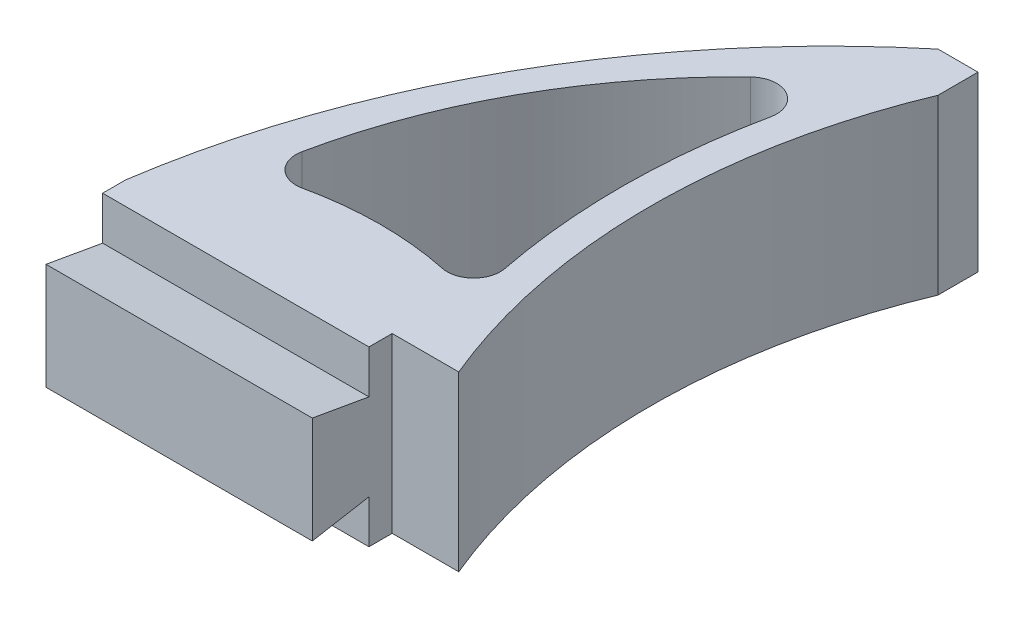
ISO-10303-21;
HEADER;
FILE_DESCRIPTION(('STEP AP214'),'2;1');
FILE_NAME('part.step','',(''),(''),'','','');
FILE_SCHEMA(('AUTOMOTIVE_DESIGN { 1 0 10303 214 1 1 1 1 }'));
ENDSEC;
DATA;
#1=APPLICATION_CONTEXT('core data for automotive mechanical design processes');
#2=APPLICATION_PROTOCOL_DEFINITION('international standard','automotive_design',2000,#1);
#3=PRODUCT_CONTEXT('',#1,'mechanical');
#4=PRODUCT('Part','Part','',(#3));
#5=PRODUCT_RELATED_PRODUCT_CATEGORY('part','',(#4));
#6=PRODUCT_DEFINITION_FORMATION('','',#4);
#7=PRODUCT_DEFINITION_CONTEXT('part definition',#1,'design');
#8=PRODUCT_DEFINITION('design','',#6,#7);
#9=PRODUCT_DEFINITION_SHAPE('','',#8);
#10=(LENGTH_UNIT() NAMED_UNIT(*) SI_UNIT(.MILLI.,.METRE.));
#11=(NAMED_UNIT(*) PLANE_ANGLE_UNIT() SI_UNIT($,.RADIAN.));
#12=(NAMED_UNIT(*) SI_UNIT($,.STERADIAN.) SOLID_ANGLE_UNIT());
#13=UNCERTAINTY_MEASURE_WITH_UNIT(LENGTH_MEASURE(1.E-05),#10,'distance_accuracy_value','');
#14=(GEOMETRIC_REPRESENTATION_CONTEXT(3) GLOBAL_UNCERTAINTY_ASSIGNED_CONTEXT((#13)) GLOBAL_UNIT_ASSIGNED_CONTEXT((#10,
#11,#12)) REPRESENTATION_CONTEXT('',''));
#15=CARTESIAN_POINT('',(0.,0.,0.));
#16=DIRECTION('',(0.,0.,1.));
#17=DIRECTION('',(1.,0.,0.));
#18=AXIS2_PLACEMENT_3D('',#15,#16,#17);
#19=CARTESIAN_POINT('',(20.,6.5,0.));
#20=DIRECTION('',(0.,0.,-1.));
#21=DIRECTION('',(-1.,0.,0.));
#22=AXIS2_PLACEMENT_3D('',#19,#20,#21);
#23=PLANE('',#22);
#24=DIRECTION('',(0.,-1.,0.));
#25=VECTOR('',#24,1.);
#26=CARTESIAN_POINT('',(20.,6.5,0.));
#27=LINE('',#26,#25);
#28=CARTESIAN_POINT('',(20.,4.,0.));
#29=VERTEX_POINT('',#28);
#30=CARTESIAN_POINT('',(20.,-4.,0.));
#31=VERTEX_POINT('',#30);
#32=EDGE_CURVE('E269',#29,#31,#27,.T.);
#33=ORIENTED_EDGE('',*,*,#32,.F.);
#34=DIRECTION('',(-1.,0.,0.));
#35=VECTOR('',#34,1.);
#36=CARTESIAN_POINT('',(25.,4.,0.));
#37=LINE('',#36,#35);
#38=CARTESIAN_POINT('',(0.,4.,0.));
#39=VERTEX_POINT('',#38);
#40=EDGE_CURVE('E249',#29,#39,#37,.T.);
#41=ORIENTED_EDGE('',*,*,#40,.T.);
#42=DIRECTION('',(0.,-1.,0.));
#43=VECTOR('',#42,1.);
#44=CARTESIAN_POINT('',(0.,6.5,0.));
#45=LINE('',#44,#43);
#46=CARTESIAN_POINT('',(0.,-4.,0.));
#47=VERTEX_POINT('',#46);
#48=EDGE_CURVE('E307',#39,#47,#45,.T.);
#49=ORIENTED_EDGE('',*,*,#48,.T.);
#50=DIRECTION('',(-1.,0.,0.));
#51=VECTOR('',#50,1.);
#52=CARTESIAN_POINT('',(25.,-4.,0.));
#53=LINE('',#52,#51);
#54=EDGE_CURVE('E261',#31,#47,#53,.T.);
#55=ORIENTED_EDGE('',*,*,#54,.F.);
#56=EDGE_LOOP('',(#33,#41,#49,#55));
#57=FACE_BOUND('',#56,.T.);
#58=ADVANCED_FACE('F44',(#57),#23,.F.);
#59=CARTESIAN_POINT('',(0.,6.5,0.));
#60=DIRECTION('',(1.,0.,0.));
#61=DIRECTION('',(0.,0.,-1.));
#62=AXIS2_PLACEMENT_3D('',#59,#60,#61);
#63=PLANE('',#62);
#64=DIRECTION('',(0.,-1.,0.));
#65=VECTOR('',#64,1.);
#66=CARTESIAN_POINT('',(0.,3.25,-4.25346136471318));
#67=LINE('',#66,#65);
#68=CARTESIAN_POINT('',(0.,6.5,-4.25346136471318));
#69=VERTEX_POINT('',#68);
#70=CARTESIAN_POINT('',(0.,3.25,-4.25346136471318));
#71=VERTEX_POINT('',#70);
#72=EDGE_CURVE('E243',#69,#71,#67,.T.);
#73=ORIENTED_EDGE('',*,*,#72,.F.);
#74=DIRECTION('',(0.,0.,1.));
#75=VECTOR('',#74,1.);
#76=CARTESIAN_POINT('',(0.,6.5,0.));
#77=LINE('',#76,#75);
#78=CARTESIAN_POINT('',(0.,6.5,-6.));
#79=VERTEX_POINT('',#78);
#80=EDGE_CURVE('E303',#79,#69,#77,.T.);
#81=ORIENTED_EDGE('',*,*,#80,.F.);
#82=DIRECTION('',(0.,-1.,0.));
#83=VECTOR('',#82,1.);
#84=CARTESIAN_POINT('',(0.,6.5,-6.));
#85=LINE('',#84,#83);
#86=CARTESIAN_POINT('',(0.,-6.5,-6.));
#87=VERTEX_POINT('',#86);
#88=EDGE_CURVE('E332',#79,#87,#85,.T.);
#89=ORIENTED_EDGE('',*,*,#88,.T.);
#90=DIRECTION('',(0.,0.,1.));
#91=VECTOR('',#90,1.);
#92=CARTESIAN_POINT('',(0.,-6.5,0.));
#93=LINE('',#92,#91);
#94=CARTESIAN_POINT('',(0.,-6.5,-4.25346136471318));
#95=VERTEX_POINT('',#94);
#96=EDGE_CURVE('E288',#87,#95,#93,.T.);
#97=ORIENTED_EDGE('',*,*,#96,.T.);
#98=DIRECTION('',(0.,-1.,0.));
#99=VECTOR('',#98,1.);
#100=CARTESIAN_POINT('',(0.,-3.25,-4.25346136471318));
#101=LINE('',#100,#99);
#102=CARTESIAN_POINT('',(0.,-3.25,-4.25346136471318));
#103=VERTEX_POINT('',#102);
#104=EDGE_CURVE('E262',#103,#95,#101,.T.);
#105=ORIENTED_EDGE('',*,*,#104,.F.);
#106=DIRECTION('',(0.,0.173648177666935,-0.984807753012207));
#107=VECTOR('',#106,1.);
#108=CARTESIAN_POINT('',(0.,-4.,0.));
#109=LINE('',#108,#107);
#110=EDGE_CURVE('E246',#47,#103,#109,.T.);
#111=ORIENTED_EDGE('',*,*,#110,.F.);
#112=ORIENTED_EDGE('',*,*,#48,.F.);
#113=DIRECTION('',(0.,0.173648177666935,0.984807753012207));
#114=VECTOR('',#113,1.);
#115=CARTESIAN_POINT('',(0.,4.,0.));
#116=LINE('',#115,#114);
#117=EDGE_CURVE('E242',#71,#39,#116,.T.);
#118=ORIENTED_EDGE('',*,*,#117,.F.);
#119=EDGE_LOOP('',(#73,#81,#89,#97,#105,#111,#112,#118));
#120=FACE_BOUND('',#119,.T.);
#121=ADVANCED_FACE('F373',(#120),#63,.F.);
#122=CARTESIAN_POINT('',(62.055417191374,6.5,3.3004917489802));
#123=DIRECTION('',(0.,-1.,0.));
#124=DIRECTION('',(0.,0.,-1.));
#125=AXIS2_PLACEMENT_3D('',#122,#123,#124);
#126=PLANE('',#125);
#127=CARTESIAN_POINT('',(45.9068852451154,6.5,-5.89585819955734));
#128=DIRECTION('',(0.,1.,0.));
#129=DIRECTION('',(0.,0.,-1.));
#130=AXIS2_PLACEMENT_3D('',#127,#128,#129);
#131=CIRCLE('',#130,42.);
#132=CARTESIAN_POINT('',(16.7762962702464,6.5,-36.1515813933143));
#133=VERTEX_POINT('',#132);
#134=CARTESIAN_POINT('',(4.78513732763163,6.5,-14.4399701025535));
#135=VERTEX_POINT('',#134);
#136=EDGE_CURVE('E215',#133,#135,#131,.T.);
#137=ORIENTED_EDGE('',*,*,#136,.F.);
#138=CARTESIAN_POINT('',(18.1634671738116,6.5,-34.7108326698021));
#139=DIRECTION('',(0.,1.,0.));
#140=DIRECTION('',(0.,0.,-1.));
#141=AXIS2_PLACEMENT_3D('',#138,#139,#140);
#142=CIRCLE('',#141,2.);
#143=CARTESIAN_POINT('',(20.1214221967614,6.5,-34.3028962432529));
#144=VERTEX_POINT('',#143);
#145=EDGE_CURVE('E58',#144,#133,#142,.T.);
#146=ORIENTED_EDGE('',*,*,#145,.F.);
#147=CARTESIAN_POINT('',(69.0702977705059,6.5,-24.1044855795233));
#148=DIRECTION('',(0.,-1.,0.));
#149=DIRECTION('',(0.,0.,1.));
#150=AXIS2_PLACEMENT_3D('',#147,#148,#149);
#151=CIRCLE('',#150,50.);
#152=CARTESIAN_POINT('',(20.0085247327654,6.5,-14.4638203331186));
#153=VERTEX_POINT('',#152);
#154=EDGE_CURVE('E195',#153,#144,#151,.T.);
#155=ORIENTED_EDGE('',*,*,#154,.F.);
#156=CARTESIAN_POINT('',(18.0460538112558,6.5,-14.0781937232624));
#157=DIRECTION('',(0.,1.,0.));
#158=DIRECTION('',(0.,0.,1.));
#159=AXIS2_PLACEMENT_3D('',#156,#157,#158);
#160=CIRCLE('',#159,2.);
#161=CARTESIAN_POINT('',(17.635235010422,6.5,-12.1208414522387));
#162=VERTEX_POINT('',#161);
#163=EDGE_CURVE('E198',#162,#153,#160,.T.);
#164=ORIENTED_EDGE('',*,*,#163,.F.);
#165=CARTESIAN_POINT('',(12.5,6.5,12.3460619355571));
#166=DIRECTION('',(0.,-1.,0.));
#167=DIRECTION('',(0.,0.,-1.));
#168=AXIS2_PLACEMENT_3D('',#165,#166,#167);
#169=CIRCLE('',#168,25.);
#170=CARTESIAN_POINT('',(7.16973685175256,6.5,-12.0790950704978));
#171=VERTEX_POINT('',#170);
#172=EDGE_CURVE('E218',#171,#162,#169,.T.);
#173=ORIENTED_EDGE('',*,*,#172,.F.);
#174=CARTESIAN_POINT('',(6.74331579989277,6.5,-14.0331076309822));
#175=DIRECTION('',(0.,1.,0.));
#176=DIRECTION('',(0.,0.,-1.));
#177=AXIS2_PLACEMENT_3D('',#174,#175,#176);
#178=CIRCLE('',#177,2.);
#179=EDGE_CURVE('E214',#135,#171,#178,.T.);
#180=ORIENTED_EDGE('',*,*,#179,.F.);
#181=EDGE_LOOP('',(#137,#146,#155,#164,#173,#180));
#182=FACE_BOUND('',#181,.T.);
#183=DIRECTION('',(-1.,0.,0.));
#184=VECTOR('',#183,1.);
#185=CARTESIAN_POINT('',(25.,6.5,-4.25346136471318));
#186=LINE('',#185,#184);
#187=CARTESIAN_POINT('',(20.,6.5,-4.25346136471318));
#188=VERTEX_POINT('',#187);
#189=EDGE_CURVE('E260',#188,#69,#186,.T.);
#190=ORIENTED_EDGE('',*,*,#189,.F.);
#191=DIRECTION('',(0.,0.,-1.));
#192=VECTOR('',#191,1.);
#193=CARTESIAN_POINT('',(20.,6.5,-6.));
#194=LINE('',#193,#192);
#195=CARTESIAN_POINT('',(20.,6.5,-6.));
#196=VERTEX_POINT('',#195);
#197=EDGE_CURVE('E284',#188,#196,#194,.T.);
#198=ORIENTED_EDGE('',*,*,#197,.T.);
#199=DIRECTION('',(1.,0.,0.));
#200=VECTOR('',#199,1.);
#201=CARTESIAN_POINT('',(25.,6.5,-6.));
#202=LINE('',#201,#200);
#203=CARTESIAN_POINT('',(25.,6.5,-6.00000000000003));
#204=VERTEX_POINT('',#203);
#205=EDGE_CURVE('E290',#196,#204,#202,.T.);
#206=ORIENTED_EDGE('',*,*,#205,.T.);
#207=CARTESIAN_POINT('',(68.4165866921848,6.5,-24.));
#208=DIRECTION('',(0.,-1.,0.));
#209=DIRECTION('',(0.,0.,1.));
#210=AXIS2_PLACEMENT_3D('',#207,#208,#209);
#211=CIRCLE('',#210,47.);
#212=CARTESIAN_POINT('',(25.,6.5,-42.));
#213=VERTEX_POINT('',#212);
#214=EDGE_CURVE('E292',#204,#213,#211,.T.);
#215=ORIENTED_EDGE('',*,*,#214,.T.);
#216=DIRECTION('',(0.,0.,-1.));
#217=VECTOR('',#216,1.);
#218=CARTESIAN_POINT('',(25.,6.5,-45.));
#219=LINE('',#218,#217);
#220=CARTESIAN_POINT('',(25.,6.5,-45.));
#221=VERTEX_POINT('',#220);
#222=EDGE_CURVE('E294',#213,#221,#219,.T.);
#223=ORIENTED_EDGE('',*,*,#222,.T.);
#224=DIRECTION('',(-1.,0.,0.));
#225=VECTOR('',#224,1.);
#226=CARTESIAN_POINT('',(22.,6.5,-45.));
#227=LINE('',#226,#225);
#228=CARTESIAN_POINT('',(22.,6.5,-45.));
#229=VERTEX_POINT('',#228);
#230=EDGE_CURVE('E300',#221,#229,#227,.T.);
#231=ORIENTED_EDGE('',*,*,#230,.T.);
#232=CARTESIAN_POINT('',(62.055417191374,6.5,3.3004917489802));
#233=DIRECTION('',(0.,1.,0.));
#234=DIRECTION('',(0.,0.,-1.));
#235=AXIS2_PLACEMENT_3D('',#232,#233,#234);
#236=CIRCLE('',#235,62.7484975881361);
#237=EDGE_CURVE('E297',#229,#79,#236,.T.);
#238=ORIENTED_EDGE('',*,*,#237,.T.);
#239=ORIENTED_EDGE('',*,*,#80,.T.);
#240=EDGE_LOOP('',(#190,#198,#206,#215,#223,#231,#238,#239));
#241=FACE_BOUND('',#240,.T.);
#242=ADVANCED_FACE('F388',(#182,#241),#126,.F.);
#243=CARTESIAN_POINT('',(62.055417191374,-6.5,3.3004917489802));
#244=DIRECTION('',(0.,-1.,0.));
#245=DIRECTION('',(0.,0.,-1.));
#246=AXIS2_PLACEMENT_3D('',#243,#244,#245);
#247=PLANE('',#246);
#248=CARTESIAN_POINT('',(18.1634671738116,-6.5,-34.7108326698021));
#249=DIRECTION('',(0.,1.,0.));
#250=DIRECTION('',(0.,0.,-1.));
#251=AXIS2_PLACEMENT_3D('',#248,#249,#250);
#252=CIRCLE('',#251,2.);
#253=CARTESIAN_POINT('',(20.1214221967614,-6.5,-34.3028962432529));
#254=VERTEX_POINT('',#253);
#255=CARTESIAN_POINT('',(16.7762962702464,-6.5,-36.1515813933143));
#256=VERTEX_POINT('',#255);
#257=EDGE_CURVE('E175',#254,#256,#252,.T.);
#258=ORIENTED_EDGE('',*,*,#257,.T.);
#259=CARTESIAN_POINT('',(45.9068852451154,-6.5,-5.89585819955734));
#260=DIRECTION('',(0.,1.,0.));
#261=DIRECTION('',(0.,0.,-1.));
#262=AXIS2_PLACEMENT_3D('',#259,#260,#261);
#263=CIRCLE('',#262,42.);
#264=CARTESIAN_POINT('',(4.78513732763164,-6.5,-14.4399701025535));
#265=VERTEX_POINT('',#264);
#266=EDGE_CURVE('E185',#256,#265,#263,.T.);
#267=ORIENTED_EDGE('',*,*,#266,.T.);
#268=CARTESIAN_POINT('',(6.74331579989277,-6.5,-14.0331076309822));
#269=DIRECTION('',(0.,1.,0.));
#270=DIRECTION('',(0.,0.,-1.));
#271=AXIS2_PLACEMENT_3D('',#268,#269,#270);
#272=CIRCLE('',#271,2.);
#273=CARTESIAN_POINT('',(7.16973685175256,-6.5,-12.0790950704978));
#274=VERTEX_POINT('',#273);
#275=EDGE_CURVE('E68',#265,#274,#272,.T.);
#276=ORIENTED_EDGE('',*,*,#275,.T.);
#277=CARTESIAN_POINT('',(12.5,-6.5,12.3460619355571));
#278=DIRECTION('',(0.,-1.,0.));
#279=DIRECTION('',(0.,0.,-1.));
#280=AXIS2_PLACEMENT_3D('',#277,#278,#279);
#281=CIRCLE('',#280,25.);
#282=CARTESIAN_POINT('',(17.635235010422,-6.5,-12.1208414522387));
#283=VERTEX_POINT('',#282);
#284=EDGE_CURVE('E203',#274,#283,#281,.T.);
#285=ORIENTED_EDGE('',*,*,#284,.T.);
#286=CARTESIAN_POINT('',(18.0460538112558,-6.5,-14.0781937232624));
#287=DIRECTION('',(0.,1.,0.));
#288=DIRECTION('',(0.,0.,1.));
#289=AXIS2_PLACEMENT_3D('',#286,#287,#288);
#290=CIRCLE('',#289,2.);
#291=CARTESIAN_POINT('',(20.0085247327654,-6.5,-14.4638203331186));
#292=VERTEX_POINT('',#291);
#293=EDGE_CURVE('E202',#283,#292,#290,.T.);
#294=ORIENTED_EDGE('',*,*,#293,.T.);
#295=CARTESIAN_POINT('',(69.0702977705059,-6.5,-24.1044855795233));
#296=DIRECTION('',(0.,-1.,0.));
#297=DIRECTION('',(0.,0.,1.));
#298=AXIS2_PLACEMENT_3D('',#295,#296,#297);
#299=CIRCLE('',#298,50.);
#300=EDGE_CURVE('E177',#292,#254,#299,.T.);
#301=ORIENTED_EDGE('',*,*,#300,.T.);
#302=EDGE_LOOP('',(#258,#267,#276,#285,#294,#301));
#303=FACE_BOUND('',#302,.T.);
#304=DIRECTION('',(0.,0.,-1.));
#305=VECTOR('',#304,1.);
#306=CARTESIAN_POINT('',(20.,-6.5,-6.));
#307=LINE('',#306,#305);
#308=CARTESIAN_POINT('',(20.,-6.5,-4.25346136471318));
#309=VERTEX_POINT('',#308);
#310=CARTESIAN_POINT('',(20.,-6.5,-6.));
#311=VERTEX_POINT('',#310);
#312=EDGE_CURVE('E281',#309,#311,#307,.T.);
#313=ORIENTED_EDGE('',*,*,#312,.F.);
#314=DIRECTION('',(-1.,0.,0.));
#315=VECTOR('',#314,1.);
#316=CARTESIAN_POINT('',(25.,-6.5,-4.25346136471318));
#317=LINE('',#316,#315);
#318=EDGE_CURVE('E257',#309,#95,#317,.T.);
#319=ORIENTED_EDGE('',*,*,#318,.T.);
#320=ORIENTED_EDGE('',*,*,#96,.F.);
#321=CARTESIAN_POINT('',(62.055417191374,-6.5,3.3004917489802));
#322=DIRECTION('',(0.,1.,0.));
#323=DIRECTION('',(0.,0.,-1.));
#324=AXIS2_PLACEMENT_3D('',#321,#322,#323);
#325=CIRCLE('',#324,62.7484975881361);
#326=CARTESIAN_POINT('',(22.,-6.5,-45.));
#327=VERTEX_POINT('',#326);
#328=EDGE_CURVE('E325',#327,#87,#325,.T.);
#329=ORIENTED_EDGE('',*,*,#328,.F.);
#330=DIRECTION('',(-1.,0.,0.));
#331=VECTOR('',#330,1.);
#332=CARTESIAN_POINT('',(22.,-6.5,-45.));
#333=LINE('',#332,#331);
#334=CARTESIAN_POINT('',(25.,-6.5,-45.));
#335=VERTEX_POINT('',#334);
#336=EDGE_CURVE('E317',#335,#327,#333,.T.);
#337=ORIENTED_EDGE('',*,*,#336,.F.);
#338=DIRECTION('',(0.,0.,-1.));
#339=VECTOR('',#338,1.);
#340=CARTESIAN_POINT('',(25.,-6.5,-45.));
#341=LINE('',#340,#339);
#342=CARTESIAN_POINT('',(25.,-6.5,-42.));
#343=VERTEX_POINT('',#342);
#344=EDGE_CURVE('E316',#343,#335,#341,.T.);
#345=ORIENTED_EDGE('',*,*,#344,.F.);
#346=CARTESIAN_POINT('',(68.4165866921848,-6.5,-24.));
#347=DIRECTION('',(0.,-1.,0.));
#348=DIRECTION('',(0.,0.,1.));
#349=AXIS2_PLACEMENT_3D('',#346,#347,#348);
#350=CIRCLE('',#349,47.);
#351=CARTESIAN_POINT('',(25.,-6.5,-6.00000000000003));
#352=VERTEX_POINT('',#351);
#353=EDGE_CURVE('E311',#352,#343,#350,.T.);
#354=ORIENTED_EDGE('',*,*,#353,.F.);
#355=DIRECTION('',(1.,0.,0.));
#356=VECTOR('',#355,1.);
#357=CARTESIAN_POINT('',(25.,-6.5,-6.));
#358=LINE('',#357,#356);
#359=EDGE_CURVE('E309',#311,#352,#358,.T.);
#360=ORIENTED_EDGE('',*,*,#359,.F.);
#361=EDGE_LOOP('',(#313,#319,#320,#329,#337,#345,#354,#360));
#362=FACE_BOUND('',#361,.T.);
#363=ADVANCED_FACE('F190',(#303,#362),#247,.T.);
#364=CARTESIAN_POINT('',(20.,6.5,-6.));
#365=DIRECTION('',(-1.,0.,0.));
#366=DIRECTION('',(0.,0.,1.));
#367=AXIS2_PLACEMENT_3D('',#364,#365,#366);
#368=PLANE('',#367);
#369=DIRECTION('',(0.,-1.,0.));
#370=VECTOR('',#369,1.);
#371=CARTESIAN_POINT('',(20.,6.5,-4.25346136471318));
#372=LINE('',#371,#370);
#373=CARTESIAN_POINT('',(20.,3.25,-4.25346136471318));
#374=VERTEX_POINT('',#373);
#375=EDGE_CURVE('E276',#188,#374,#372,.T.);
#376=ORIENTED_EDGE('',*,*,#375,.T.);
#377=DIRECTION('',(0.,0.173648177666935,0.984807753012207));
#378=VECTOR('',#377,1.);
#379=CARTESIAN_POINT('',(20.,3.04932379404059,-5.39155268320062));
#380=LINE('',#379,#378);
#381=EDGE_CURVE('E11',#374,#29,#380,.T.);
#382=ORIENTED_EDGE('',*,*,#381,.T.);
#383=ORIENTED_EDGE('',*,*,#32,.T.);
#384=DIRECTION('',(0.,0.173648177666935,-0.984807753012207));
#385=VECTOR('',#384,1.);
#386=CARTESIAN_POINT('',(20.,-2.65732582914897,-7.61468361481752));
#387=LINE('',#386,#385);
#388=CARTESIAN_POINT('',(20.,-3.25,-4.25346136471318));
#389=VERTEX_POINT('',#388);
#390=EDGE_CURVE('E52',#31,#389,#387,.T.);
#391=ORIENTED_EDGE('',*,*,#390,.T.);
#392=DIRECTION('',(0.,-1.,0.));
#393=VECTOR('',#392,1.);
#394=CARTESIAN_POINT('',(20.,6.5,-4.25346136471317));
#395=LINE('',#394,#393);
#396=EDGE_CURVE('E255',#389,#309,#395,.T.);
#397=ORIENTED_EDGE('',*,*,#396,.T.);
#398=ORIENTED_EDGE('',*,*,#312,.T.);
#399=DIRECTION('',(0.,-1.,0.));
#400=VECTOR('',#399,1.);
#401=CARTESIAN_POINT('',(20.,6.5,-6.));
#402=LINE('',#401,#400);
#403=EDGE_CURVE('E353',#196,#311,#402,.T.);
#404=ORIENTED_EDGE('',*,*,#403,.F.);
#405=ORIENTED_EDGE('',*,*,#197,.F.);
#406=EDGE_LOOP('',(#376,#382,#383,#391,#397,#398,#404,#405));
#407=FACE_BOUND('',#406,.T.);
#408=ADVANCED_FACE('F359',(#407),#368,.F.);
#409=CARTESIAN_POINT('',(25.,6.5,-6.));
#410=DIRECTION('',(0.,0.,-1.));
#411=DIRECTION('',(-1.,0.,0.));
#412=AXIS2_PLACEMENT_3D('',#409,#410,#411);
#413=PLANE('',#412);
#414=ORIENTED_EDGE('',*,*,#359,.T.);
#415=DIRECTION('',(0.,-1.,0.));
#416=VECTOR('',#415,1.);
#417=CARTESIAN_POINT('',(25.,6.5,-6.00000000000003));
#418=LINE('',#417,#416);
#419=EDGE_CURVE('E350',#204,#352,#418,.T.);
#420=ORIENTED_EDGE('',*,*,#419,.F.);
#421=ORIENTED_EDGE('',*,*,#205,.F.);
#422=ORIENTED_EDGE('',*,*,#403,.T.);
#423=EDGE_LOOP('',(#414,#420,#421,#422));
#424=FACE_BOUND('',#423,.T.);
#425=ADVANCED_FACE('F384',(#424),#413,.F.);
#426=CARTESIAN_POINT('',(68.4165866921848,6.5,-24.));
#427=DIRECTION('',(0.,-1.,0.));
#428=DIRECTION('',(0.,0.,-1.));
#429=AXIS2_PLACEMENT_3D('',#426,#427,#428);
#430=CYLINDRICAL_SURFACE('',#429,47.);
#431=ORIENTED_EDGE('',*,*,#353,.T.);
#432=DIRECTION('',(0.,-1.,0.));
#433=VECTOR('',#432,1.);
#434=CARTESIAN_POINT('',(25.,6.5,-42.));
#435=LINE('',#434,#433);
#436=EDGE_CURVE('E343',#213,#343,#435,.T.);
#437=ORIENTED_EDGE('',*,*,#436,.F.);
#438=ORIENTED_EDGE('',*,*,#214,.F.);
#439=ORIENTED_EDGE('',*,*,#419,.T.);
#440=EDGE_LOOP('',(#431,#437,#438,#439));
#441=FACE_BOUND('',#440,.T.);
#442=ADVANCED_FACE('F429',(#441),#430,.F.);
#443=CARTESIAN_POINT('',(25.,6.5,-45.));
#444=DIRECTION('',(-1.,0.,0.));
#445=DIRECTION('',(0.,0.,1.));
#446=AXIS2_PLACEMENT_3D('',#443,#444,#445);
#447=PLANE('',#446);
#448=ORIENTED_EDGE('',*,*,#344,.T.);
#449=DIRECTION('',(0.,-1.,0.));
#450=VECTOR('',#449,1.);
#451=CARTESIAN_POINT('',(25.,6.5,-45.));
#452=LINE('',#451,#450);
#453=EDGE_CURVE('E339',#221,#335,#452,.T.);
#454=ORIENTED_EDGE('',*,*,#453,.F.);
#455=ORIENTED_EDGE('',*,*,#222,.F.);
#456=ORIENTED_EDGE('',*,*,#436,.T.);
#457=EDGE_LOOP('',(#448,#454,#455,#456));
#458=FACE_BOUND('',#457,.T.);
#459=ADVANCED_FACE('F426',(#458),#447,.F.);
#460=CARTESIAN_POINT('',(22.,6.5,-45.));
#461=DIRECTION('',(0.,0.,1.));
#462=DIRECTION('',(1.,0.,0.));
#463=AXIS2_PLACEMENT_3D('',#460,#461,#462);
#464=PLANE('',#463);
#465=ORIENTED_EDGE('',*,*,#336,.T.);
#466=DIRECTION('',(0.,-1.,0.));
#467=VECTOR('',#466,1.);
#468=CARTESIAN_POINT('',(22.,6.5,-45.));
#469=LINE('',#468,#467);
#470=EDGE_CURVE('E333',#229,#327,#469,.T.);
#471=ORIENTED_EDGE('',*,*,#470,.F.);
#472=ORIENTED_EDGE('',*,*,#230,.F.);
#473=ORIENTED_EDGE('',*,*,#453,.T.);
#474=EDGE_LOOP('',(#465,#471,#472,#473));
#475=FACE_BOUND('',#474,.T.);
#476=ADVANCED_FACE('F425',(#475),#464,.F.);
#477=CARTESIAN_POINT('',(62.055417191374,6.5,3.3004917489802));
#478=DIRECTION('',(0.,-1.,0.));
#479=DIRECTION('',(0.,0.,-1.));
#480=AXIS2_PLACEMENT_3D('',#477,#478,#479);
#481=CYLINDRICAL_SURFACE('',#480,62.7484975881361);
#482=ORIENTED_EDGE('',*,*,#328,.T.);
#483=ORIENTED_EDGE('',*,*,#88,.F.);
#484=ORIENTED_EDGE('',*,*,#237,.F.);
#485=ORIENTED_EDGE('',*,*,#470,.T.);
#486=EDGE_LOOP('',(#482,#483,#484,#485));
#487=FACE_BOUND('',#486,.T.);
#488=ADVANCED_FACE('F419',(#487),#481,.T.);
#489=CARTESIAN_POINT('',(25.,-4.,0.));
#490=DIRECTION('',(0.,0.984807753012207,0.173648177666935));
#491=DIRECTION('',(0.,-0.173648177666935,0.984807753012207));
#492=AXIS2_PLACEMENT_3D('',#489,#490,#491);
#493=PLANE('',#492);
#494=ORIENTED_EDGE('',*,*,#54,.T.);
#495=ORIENTED_EDGE('',*,*,#110,.T.);
#496=DIRECTION('',(-1.,0.,0.));
#497=VECTOR('',#496,1.);
#498=CARTESIAN_POINT('',(25.,-3.25,-4.25346136471318));
#499=LINE('',#498,#497);
#500=EDGE_CURVE('E229',#389,#103,#499,.T.);
#501=ORIENTED_EDGE('',*,*,#500,.F.);
#502=ORIENTED_EDGE('',*,*,#390,.F.);
#503=EDGE_LOOP('',(#494,#495,#501,#502));
#504=FACE_BOUND('',#503,.T.);
#505=ADVANCED_FACE('F368',(#504),#493,.F.);
#506=CARTESIAN_POINT('',(25.,-3.25,-4.25346136471318));
#507=DIRECTION('',(0.,0.,-1.));
#508=DIRECTION('',(0.,1.,0.));
#509=AXIS2_PLACEMENT_3D('',#506,#507,#508);
#510=PLANE('',#509);
#511=ORIENTED_EDGE('',*,*,#500,.T.);
#512=ORIENTED_EDGE('',*,*,#104,.T.);
#513=ORIENTED_EDGE('',*,*,#318,.F.);
#514=ORIENTED_EDGE('',*,*,#396,.F.);
#515=EDGE_LOOP('',(#511,#512,#513,#514));
#516=FACE_BOUND('',#515,.T.);
#517=ADVANCED_FACE('F380',(#516),#510,.F.);
#518=CARTESIAN_POINT('',(25.,4.,0.));
#519=DIRECTION('',(0.,-0.984807753012207,0.173648177666935));
#520=DIRECTION('',(0.,-0.173648177666935,-0.984807753012207));
#521=AXIS2_PLACEMENT_3D('',#518,#519,#520);
#522=PLANE('',#521);
#523=DIRECTION('',(-1.,0.,0.));
#524=VECTOR('',#523,1.);
#525=CARTESIAN_POINT('',(25.,3.25,-4.25346136471318));
#526=LINE('',#525,#524);
#527=EDGE_CURVE('E247',#374,#71,#526,.T.);
#528=ORIENTED_EDGE('',*,*,#527,.T.);
#529=ORIENTED_EDGE('',*,*,#117,.T.);
#530=ORIENTED_EDGE('',*,*,#40,.F.);
#531=ORIENTED_EDGE('',*,*,#381,.F.);
#532=EDGE_LOOP('',(#528,#529,#530,#531));
#533=FACE_BOUND('',#532,.T.);
#534=ADVANCED_FACE('F396',(#533),#522,.F.);
#535=CARTESIAN_POINT('',(25.,3.25,-4.25346136471318));
#536=DIRECTION('',(0.,0.,-1.));
#537=DIRECTION('',(0.,1.,0.));
#538=AXIS2_PLACEMENT_3D('',#535,#536,#537);
#539=PLANE('',#538);
#540=ORIENTED_EDGE('',*,*,#189,.T.);
#541=ORIENTED_EDGE('',*,*,#72,.T.);
#542=ORIENTED_EDGE('',*,*,#527,.F.);
#543=ORIENTED_EDGE('',*,*,#375,.F.);
#544=EDGE_LOOP('',(#540,#541,#542,#543));
#545=FACE_BOUND('',#544,.T.);
#546=ADVANCED_FACE('F394',(#545),#539,.F.);
#547=CARTESIAN_POINT('',(18.1634671738116,-6.5,-34.7108326698021));
#548=DIRECTION('',(0.,1.,0.));
#549=DIRECTION('',(0.,0.,1.));
#550=AXIS2_PLACEMENT_3D('',#547,#548,#549);
#551=CYLINDRICAL_SURFACE('',#550,2.);
#552=ORIENTED_EDGE('',*,*,#145,.T.);
#553=DIRECTION('',(0.,1.,0.));
#554=VECTOR('',#553,1.);
#555=CARTESIAN_POINT('',(16.7762962702464,-6.5,-36.1515813933143));
#556=LINE('',#555,#554);
#557=EDGE_CURVE('E169',#256,#133,#556,.T.);
#558=ORIENTED_EDGE('',*,*,#557,.F.);
#559=ORIENTED_EDGE('',*,*,#257,.F.);
#560=DIRECTION('',(0.,1.,0.));
#561=VECTOR('',#560,1.);
#562=CARTESIAN_POINT('',(20.1214221967614,-6.5,-34.3028962432529));
#563=LINE('',#562,#561);
#564=EDGE_CURVE('E228',#254,#144,#563,.T.);
#565=ORIENTED_EDGE('',*,*,#564,.T.);
#566=EDGE_LOOP('',(#552,#558,#559,#565));
#567=FACE_BOUND('',#566,.T.);
#568=ADVANCED_FACE('F168',(#567),#551,.F.);
#569=CARTESIAN_POINT('',(69.0702977705059,-6.5,-24.1044855795233));
#570=DIRECTION('',(0.,1.,0.));
#571=DIRECTION('',(0.,0.,1.));
#572=AXIS2_PLACEMENT_3D('',#569,#570,#571);
#573=CYLINDRICAL_SURFACE('',#572,50.);
#574=ORIENTED_EDGE('',*,*,#154,.T.);
#575=ORIENTED_EDGE('',*,*,#564,.F.);
#576=ORIENTED_EDGE('',*,*,#300,.F.);
#577=DIRECTION('',(0.,1.,0.));
#578=VECTOR('',#577,1.);
#579=CARTESIAN_POINT('',(20.0085247327654,-6.5,-14.4638203331186));
#580=LINE('',#579,#578);
#581=EDGE_CURVE('E227',#292,#153,#580,.T.);
#582=ORIENTED_EDGE('',*,*,#581,.T.);
#583=EDGE_LOOP('',(#574,#575,#576,#582));
#584=FACE_BOUND('',#583,.T.);
#585=ADVANCED_FACE('F451',(#584),#573,.T.);
#586=CARTESIAN_POINT('',(18.0460538112558,-6.5,-14.0781937232624));
#587=DIRECTION('',(0.,1.,0.));
#588=DIRECTION('',(0.,0.,1.));
#589=AXIS2_PLACEMENT_3D('',#586,#587,#588);
#590=CYLINDRICAL_SURFACE('',#589,2.);
#591=ORIENTED_EDGE('',*,*,#163,.T.);
#592=ORIENTED_EDGE('',*,*,#581,.F.);
#593=ORIENTED_EDGE('',*,*,#293,.F.);
#594=DIRECTION('',(0.,1.,0.));
#595=VECTOR('',#594,1.);
#596=CARTESIAN_POINT('',(17.635235010422,-6.5,-12.1208414522387));
#597=LINE('',#596,#595);
#598=EDGE_CURVE('E233',#283,#162,#597,.T.);
#599=ORIENTED_EDGE('',*,*,#598,.T.);
#600=EDGE_LOOP('',(#591,#592,#593,#599));
#601=FACE_BOUND('',#600,.T.);
#602=ADVANCED_FACE('F459',(#601),#590,.F.);
#603=CARTESIAN_POINT('',(12.5,-6.5,12.3460619355571));
#604=DIRECTION('',(0.,1.,0.));
#605=DIRECTION('',(0.,0.,1.));
#606=AXIS2_PLACEMENT_3D('',#603,#604,#605);
#607=CYLINDRICAL_SURFACE('',#606,25.);
#608=ORIENTED_EDGE('',*,*,#172,.T.);
#609=ORIENTED_EDGE('',*,*,#598,.F.);
#610=ORIENTED_EDGE('',*,*,#284,.F.);
#611=DIRECTION('',(0.,1.,0.));
#612=VECTOR('',#611,1.);
#613=CARTESIAN_POINT('',(7.16973685175256,-6.5,-12.0790950704978));
#614=LINE('',#613,#612);
#615=EDGE_CURVE('E237',#274,#171,#614,.T.);
#616=ORIENTED_EDGE('',*,*,#615,.T.);
#617=EDGE_LOOP('',(#608,#609,#610,#616));
#618=FACE_BOUND('',#617,.T.);
#619=ADVANCED_FACE('F468',(#618),#607,.T.);
#620=CARTESIAN_POINT('',(6.74331579989277,-6.5,-14.0331076309822));
#621=DIRECTION('',(0.,1.,0.));
#622=DIRECTION('',(0.,0.,1.));
#623=AXIS2_PLACEMENT_3D('',#620,#621,#622);
#624=CYLINDRICAL_SURFACE('',#623,2.);
#625=ORIENTED_EDGE('',*,*,#179,.T.);
#626=ORIENTED_EDGE('',*,*,#615,.F.);
#627=ORIENTED_EDGE('',*,*,#275,.F.);
#628=DIRECTION('',(0.,1.,0.));
#629=VECTOR('',#628,1.);
#630=CARTESIAN_POINT('',(4.78513732763163,-6.5,-14.4399701025535));
#631=LINE('',#630,#629);
#632=EDGE_CURVE('E178',#265,#135,#631,.T.);
#633=ORIENTED_EDGE('',*,*,#632,.T.);
#634=EDGE_LOOP('',(#625,#626,#627,#633));
#635=FACE_BOUND('',#634,.T.);
#636=ADVANCED_FACE('F480',(#635),#624,.F.);
#637=CARTESIAN_POINT('',(45.9068852451154,-6.5,-5.89585819955734));
#638=DIRECTION('',(0.,1.,0.));
#639=DIRECTION('',(0.,0.,1.));
#640=AXIS2_PLACEMENT_3D('',#637,#638,#639);
#641=CYLINDRICAL_SURFACE('',#640,42.);
#642=ORIENTED_EDGE('',*,*,#136,.T.);
#643=ORIENTED_EDGE('',*,*,#632,.F.);
#644=ORIENTED_EDGE('',*,*,#266,.F.);
#645=ORIENTED_EDGE('',*,*,#557,.T.);
#646=EDGE_LOOP('',(#642,#643,#644,#645));
#647=FACE_BOUND('',#646,.T.);
#648=ADVANCED_FACE('F181',(#647),#641,.F.);
#649=CLOSED_SHELL('',(#58,#121,#242,#363,#408,#425,#442,#459,#476,#488,#505,#517,#534,#546,#568,
#585,#602,#619,#636,#648));
#650=MANIFOLD_SOLID_BREP('B2',#649);
#651=ADVANCED_BREP_SHAPE_REPRESENTATION('',(#18,#650),#14);
#652=SHAPE_DEFINITION_REPRESENTATION(#9,#651);
ENDSEC;
END-ISO-10303-21;
